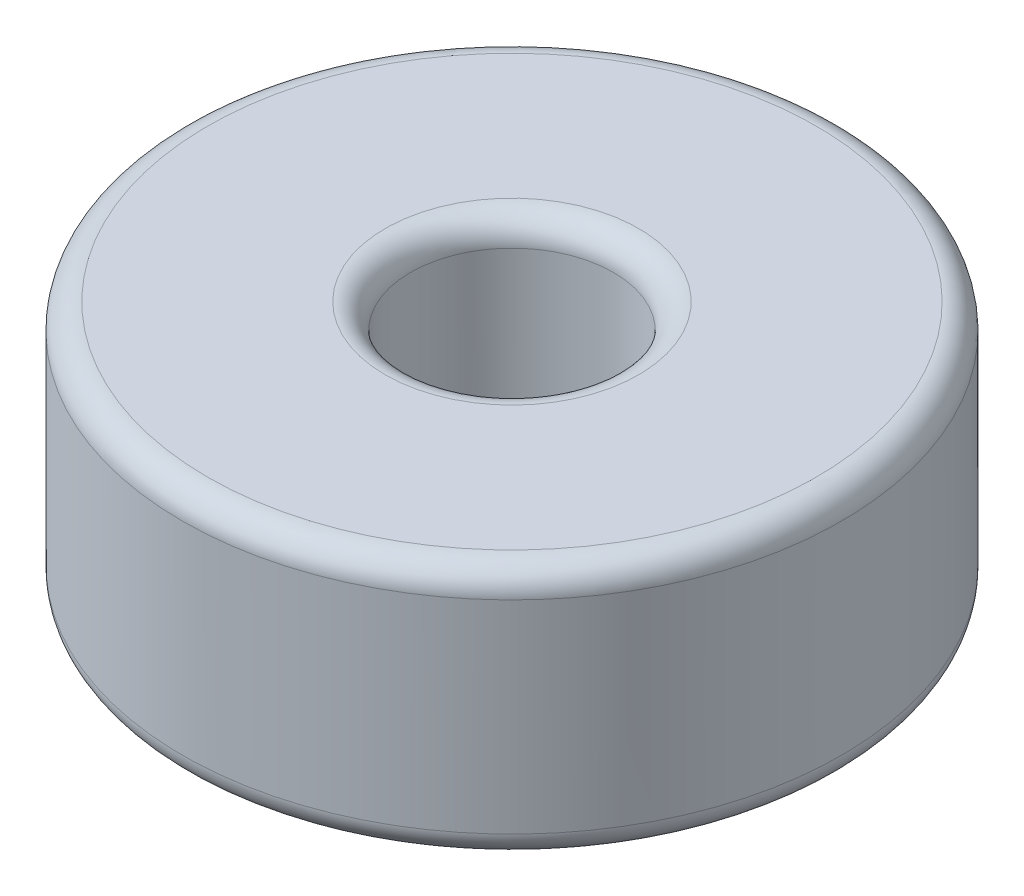
ISO-10303-21;
HEADER;
FILE_DESCRIPTION(('STEP AP214'),'2;1');
FILE_NAME('part.step','',(''),(''),'','','');
FILE_SCHEMA(('AUTOMOTIVE_DESIGN { 1 0 10303 214 1 1 1 1 }'));
ENDSEC;
DATA;
#1=APPLICATION_CONTEXT('core data for automotive mechanical design processes');
#2=APPLICATION_PROTOCOL_DEFINITION('international standard','automotive_design',2000,#1);
#3=PRODUCT_CONTEXT('',#1,'mechanical');
#4=PRODUCT('Part','Part','',(#3));
#5=PRODUCT_RELATED_PRODUCT_CATEGORY('part','',(#4));
#6=PRODUCT_DEFINITION_FORMATION('','',#4);
#7=PRODUCT_DEFINITION_CONTEXT('part definition',#1,'design');
#8=PRODUCT_DEFINITION('design','',#6,#7);
#9=PRODUCT_DEFINITION_SHAPE('','',#8);
#10=(LENGTH_UNIT() NAMED_UNIT(*) SI_UNIT(.MILLI.,.METRE.));
#11=(NAMED_UNIT(*) PLANE_ANGLE_UNIT() SI_UNIT($,.RADIAN.));
#12=(NAMED_UNIT(*) SI_UNIT($,.STERADIAN.) SOLID_ANGLE_UNIT());
#13=UNCERTAINTY_MEASURE_WITH_UNIT(LENGTH_MEASURE(1.E-05),#10,'distance_accuracy_value','');
#14=(GEOMETRIC_REPRESENTATION_CONTEXT(3) GLOBAL_UNCERTAINTY_ASSIGNED_CONTEXT((#13)) GLOBAL_UNIT_ASSIGNED_CONTEXT((#10,
#11,#12)) REPRESENTATION_CONTEXT('',''));
#15=CARTESIAN_POINT('',(0.,0.,0.));
#16=DIRECTION('',(0.,0.,1.));
#17=DIRECTION('',(1.,0.,0.));
#18=AXIS2_PLACEMENT_3D('',#15,#16,#17);
#19=CARTESIAN_POINT('',(0.,0.,0.));
#20=DIRECTION('',(0.,-1.,0.));
#21=DIRECTION('',(0.,0.,-1.));
#22=AXIS2_PLACEMENT_3D('',#19,#20,#21);
#23=CYLINDRICAL_SURFACE('',#22,2.);
#24=CARTESIAN_POINT('',(0.,0.5,0.));
#25=DIRECTION('',(0.,-1.,0.));
#26=DIRECTION('',(0.,0.,-1.));
#27=AXIS2_PLACEMENT_3D('',#24,#25,#26);
#28=CIRCLE('',#27,2.);
#29=CARTESIAN_POINT('',(0.,0.5,-2.));
#30=VERTEX_POINT('',#29);
#31=EDGE_CURVE('E58',#30,#30,#28,.T.);
#32=ORIENTED_EDGE('',*,*,#31,.T.);
#33=EDGE_LOOP('',(#32));
#34=FACE_BOUND('',#33,.T.);
#35=CARTESIAN_POINT('',(0.,4.5,0.));
#36=DIRECTION('',(0.,1.,0.));
#37=DIRECTION('',(0.,0.,1.));
#38=AXIS2_PLACEMENT_3D('',#35,#36,#37);
#39=CIRCLE('',#38,2.);
#40=CARTESIAN_POINT('',(0.,4.5,2.));
#41=VERTEX_POINT('',#40);
#42=EDGE_CURVE('E61',#41,#41,#39,.T.);
#43=ORIENTED_EDGE('',*,*,#42,.T.);
#44=EDGE_LOOP('',(#43));
#45=FACE_BOUND('',#44,.T.);
#46=ADVANCED_FACE('F32',(#34,#45),#23,.F.);
#47=CARTESIAN_POINT('',(2.,5.,0.));
#48=DIRECTION('',(0.,1.,0.));
#49=DIRECTION('',(0.,0.,1.));
#50=AXIS2_PLACEMENT_3D('',#47,#48,#49);
#51=PLANE('',#50);
#52=CARTESIAN_POINT('',(0.,5.,0.));
#53=DIRECTION('',(0.,1.,0.));
#54=DIRECTION('',(0.,0.,1.));
#55=AXIS2_PLACEMENT_3D('',#52,#53,#54);
#56=CIRCLE('',#55,6.);
#57=CARTESIAN_POINT('',(0.,5.,6.));
#58=VERTEX_POINT('',#57);
#59=EDGE_CURVE('E10',#58,#58,#56,.T.);
#60=ORIENTED_EDGE('',*,*,#59,.T.);
#61=EDGE_LOOP('',(#60));
#62=FACE_BOUND('',#61,.T.);
#63=CARTESIAN_POINT('',(0.,5.,0.));
#64=DIRECTION('',(0.,1.,0.));
#65=DIRECTION('',(0.,0.,1.));
#66=AXIS2_PLACEMENT_3D('',#63,#64,#65);
#67=CIRCLE('',#66,2.5);
#68=CARTESIAN_POINT('',(0.,5.,2.5));
#69=VERTEX_POINT('',#68);
#70=EDGE_CURVE('E39',#69,#69,#67,.F.);
#71=ORIENTED_EDGE('',*,*,#70,.T.);
#72=EDGE_LOOP('',(#71));
#73=FACE_BOUND('',#72,.T.);
#74=ADVANCED_FACE('F75',(#62,#73),#51,.T.);
#75=CARTESIAN_POINT('',(0.,0.,0.));
#76=DIRECTION('',(0.,-1.,0.));
#77=DIRECTION('',(0.,0.,-1.));
#78=AXIS2_PLACEMENT_3D('',#75,#76,#77);
#79=CYLINDRICAL_SURFACE('',#78,6.5);
#80=CARTESIAN_POINT('',(0.,0.5,0.));
#81=DIRECTION('',(0.,-1.,0.));
#82=DIRECTION('',(0.,0.,-1.));
#83=AXIS2_PLACEMENT_3D('',#80,#81,#82);
#84=CIRCLE('',#83,6.5);
#85=CARTESIAN_POINT('',(0.,0.5,-6.5));
#86=VERTEX_POINT('',#85);
#87=EDGE_CURVE('E43',#86,#86,#84,.F.);
#88=ORIENTED_EDGE('',*,*,#87,.T.);
#89=EDGE_LOOP('',(#88));
#90=FACE_BOUND('',#89,.T.);
#91=CARTESIAN_POINT('',(0.,4.5,0.));
#92=DIRECTION('',(0.,1.,0.));
#93=DIRECTION('',(0.,0.,1.));
#94=AXIS2_PLACEMENT_3D('',#91,#92,#93);
#95=CIRCLE('',#94,6.5);
#96=CARTESIAN_POINT('',(0.,4.5,6.5));
#97=VERTEX_POINT('',#96);
#98=EDGE_CURVE('E47',#97,#97,#95,.F.);
#99=ORIENTED_EDGE('',*,*,#98,.T.);
#100=EDGE_LOOP('',(#99));
#101=FACE_BOUND('',#100,.T.);
#102=ADVANCED_FACE('F81',(#90,#101),#79,.T.);
#103=CARTESIAN_POINT('',(2.,0.,0.));
#104=DIRECTION('',(0.,-1.,0.));
#105=DIRECTION('',(0.,0.,-1.));
#106=AXIS2_PLACEMENT_3D('',#103,#104,#105);
#107=PLANE('',#106);
#108=CARTESIAN_POINT('',(0.,0.,0.));
#109=DIRECTION('',(0.,-1.,0.));
#110=DIRECTION('',(0.,0.,-1.));
#111=AXIS2_PLACEMENT_3D('',#108,#109,#110);
#112=CIRCLE('',#111,2.5);
#113=CARTESIAN_POINT('',(0.,0.,-2.5));
#114=VERTEX_POINT('',#113);
#115=EDGE_CURVE('E52',#114,#114,#112,.F.);
#116=ORIENTED_EDGE('',*,*,#115,.T.);
#117=EDGE_LOOP('',(#116));
#118=FACE_BOUND('',#117,.T.);
#119=CARTESIAN_POINT('',(0.,0.,0.));
#120=DIRECTION('',(0.,-1.,0.));
#121=DIRECTION('',(0.,0.,-1.));
#122=AXIS2_PLACEMENT_3D('',#119,#120,#121);
#123=CIRCLE('',#122,6.);
#124=CARTESIAN_POINT('',(0.,0.,-6.));
#125=VERTEX_POINT('',#124);
#126=EDGE_CURVE('E55',#125,#125,#123,.T.);
#127=ORIENTED_EDGE('',*,*,#126,.T.);
#128=EDGE_LOOP('',(#127));
#129=FACE_BOUND('',#128,.T.);
#130=ADVANCED_FACE('F88',(#118,#129),#107,.T.);
#131=CARTESIAN_POINT('',(0.,0.5,0.));
#132=DIRECTION('',(0.,-1.,0.));
#133=DIRECTION('',(0.,0.,-1.));
#134=AXIS2_PLACEMENT_3D('',#131,#132,#133);
#135=TOROIDAL_SURFACE('',#134,2.5,0.5);
#136=ORIENTED_EDGE('',*,*,#115,.F.);
#137=EDGE_LOOP('',(#136));
#138=FACE_BOUND('',#137,.T.);
#139=ORIENTED_EDGE('',*,*,#31,.F.);
#140=EDGE_LOOP('',(#139));
#141=FACE_BOUND('',#140,.T.);
#142=ADVANCED_FACE('F85',(#138,#141),#135,.T.);
#143=CARTESIAN_POINT('',(0.,0.5,0.));
#144=DIRECTION('',(0.,-1.,0.));
#145=DIRECTION('',(0.,0.,-1.));
#146=AXIS2_PLACEMENT_3D('',#143,#144,#145);
#147=TOROIDAL_SURFACE('',#146,6.,0.5);
#148=ORIENTED_EDGE('',*,*,#87,.F.);
#149=EDGE_LOOP('',(#148));
#150=FACE_BOUND('',#149,.T.);
#151=ORIENTED_EDGE('',*,*,#126,.F.);
#152=EDGE_LOOP('',(#151));
#153=FACE_BOUND('',#152,.T.);
#154=ADVANCED_FACE('F72',(#150,#153),#147,.T.);
#155=CARTESIAN_POINT('',(0.,4.5,0.));
#156=DIRECTION('',(0.,1.,0.));
#157=DIRECTION('',(0.,0.,1.));
#158=AXIS2_PLACEMENT_3D('',#155,#156,#157);
#159=TOROIDAL_SURFACE('',#158,6.,0.5);
#160=ORIENTED_EDGE('',*,*,#59,.F.);
#161=EDGE_LOOP('',(#160));
#162=FACE_BOUND('',#161,.T.);
#163=ORIENTED_EDGE('',*,*,#98,.F.);
#164=EDGE_LOOP('',(#163));
#165=FACE_BOUND('',#164,.T.);
#166=ADVANCED_FACE('F68',(#162,#165),#159,.T.);
#167=CARTESIAN_POINT('',(0.,4.5,0.));
#168=DIRECTION('',(0.,1.,0.));
#169=DIRECTION('',(0.,0.,1.));
#170=AXIS2_PLACEMENT_3D('',#167,#168,#169);
#171=TOROIDAL_SURFACE('',#170,2.5,0.5);
#172=ORIENTED_EDGE('',*,*,#42,.F.);
#173=EDGE_LOOP('',(#172));
#174=FACE_BOUND('',#173,.T.);
#175=ORIENTED_EDGE('',*,*,#70,.F.);
#176=EDGE_LOOP('',(#175));
#177=FACE_BOUND('',#176,.T.);
#178=ADVANCED_FACE('F34',(#174,#177),#171,.T.);
#179=CLOSED_SHELL('',(#46,#74,#102,#130,#142,#154,#166,#178));
#180=MANIFOLD_SOLID_BREP('B2',#179);
#181=ADVANCED_BREP_SHAPE_REPRESENTATION('',(#18,#180),#14);
#182=SHAPE_DEFINITION_REPRESENTATION(#9,#181);
ENDSEC;
END-ISO-10303-21;
